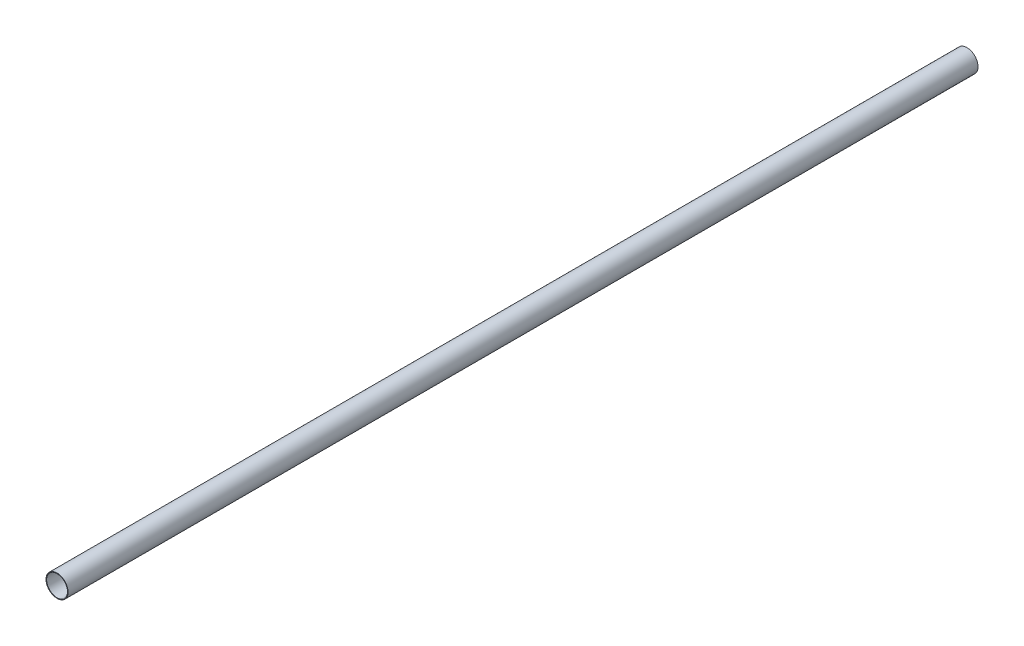
ISO-10303-21;
HEADER;
FILE_DESCRIPTION(('STEP AP214'),'2;1');
FILE_NAME('part.step','',(''),(''),'','','');
FILE_SCHEMA(('AUTOMOTIVE_DESIGN { 1 0 10303 214 1 1 1 1 }'));
ENDSEC;
DATA;
#1=APPLICATION_CONTEXT('core data for automotive mechanical design processes');
#2=APPLICATION_PROTOCOL_DEFINITION('international standard','automotive_design',2000,#1);
#3=PRODUCT_CONTEXT('',#1,'mechanical');
#4=PRODUCT('Part','Part','',(#3));
#5=PRODUCT_RELATED_PRODUCT_CATEGORY('part','',(#4));
#6=PRODUCT_DEFINITION_FORMATION('','',#4);
#7=PRODUCT_DEFINITION_CONTEXT('part definition',#1,'design');
#8=PRODUCT_DEFINITION('design','',#6,#7);
#9=PRODUCT_DEFINITION_SHAPE('','',#8);
#10=(LENGTH_UNIT() NAMED_UNIT(*) SI_UNIT(.MILLI.,.METRE.));
#11=(NAMED_UNIT(*) PLANE_ANGLE_UNIT() SI_UNIT($,.RADIAN.));
#12=(NAMED_UNIT(*) SI_UNIT($,.STERADIAN.) SOLID_ANGLE_UNIT());
#13=UNCERTAINTY_MEASURE_WITH_UNIT(LENGTH_MEASURE(1.E-05),#10,'distance_accuracy_value','');
#14=(GEOMETRIC_REPRESENTATION_CONTEXT(3) GLOBAL_UNCERTAINTY_ASSIGNED_CONTEXT((#13)) GLOBAL_UNIT_ASSIGNED_CONTEXT((#10,
#11,#12)) REPRESENTATION_CONTEXT('',''));
#15=CARTESIAN_POINT('',(0.,0.,0.));
#16=DIRECTION('',(0.,0.,1.));
#17=DIRECTION('',(1.,0.,0.));
#18=AXIS2_PLACEMENT_3D('',#15,#16,#17);
#19=CARTESIAN_POINT('',(0.,0.,927.5));
#20=DIRECTION('',(0.,0.,1.));
#21=DIRECTION('',(1.,0.,0.));
#22=AXIS2_PLACEMENT_3D('',#19,#20,#21);
#23=PLANE('',#22);
#24=CARTESIAN_POINT('',(0.,0.,927.5));
#25=DIRECTION('',(0.,0.,1.));
#26=DIRECTION('',(1.,0.,0.));
#27=AXIS2_PLACEMENT_3D('',#24,#25,#26);
#28=CIRCLE('',#27,11.25);
#29=CARTESIAN_POINT('',(-11.25,0.,927.5));
#30=VERTEX_POINT('',#29);
#31=EDGE_CURVE('E10',#30,#30,#28,.T.);
#32=ORIENTED_EDGE('',*,*,#31,.T.);
#33=EDGE_LOOP('',(#32));
#34=FACE_BOUND('',#33,.T.);
#35=CARTESIAN_POINT('',(0.,0.,927.5));
#36=DIRECTION('',(0.,0.,1.));
#37=DIRECTION('',(1.,0.,0.));
#38=AXIS2_PLACEMENT_3D('',#35,#36,#37);
#39=CIRCLE('',#38,10.65);
#40=CARTESIAN_POINT('',(-10.65,0.,927.5));
#41=VERTEX_POINT('',#40);
#42=EDGE_CURVE('E44',#41,#41,#39,.T.);
#43=ORIENTED_EDGE('',*,*,#42,.F.);
#44=EDGE_LOOP('',(#43));
#45=FACE_BOUND('',#44,.T.);
#46=ADVANCED_FACE('F33',(#34,#45),#23,.T.);
#47=CARTESIAN_POINT('',(0.,0.,0.));
#48=DIRECTION('',(0.,0.,1.));
#49=DIRECTION('',(1.,0.,0.));
#50=AXIS2_PLACEMENT_3D('',#47,#48,#49);
#51=PLANE('',#50);
#52=CARTESIAN_POINT('',(0.,0.,0.));
#53=DIRECTION('',(0.,0.,1.));
#54=DIRECTION('',(1.,0.,0.));
#55=AXIS2_PLACEMENT_3D('',#52,#53,#54);
#56=CIRCLE('',#55,11.25);
#57=CARTESIAN_POINT('',(-11.25,0.,-1.11022302462516E-13));
#58=VERTEX_POINT('',#57);
#59=EDGE_CURVE('E37',#58,#58,#56,.T.);
#60=ORIENTED_EDGE('',*,*,#59,.F.);
#61=EDGE_LOOP('',(#60));
#62=FACE_BOUND('',#61,.T.);
#63=CARTESIAN_POINT('',(0.,0.,0.));
#64=DIRECTION('',(0.,0.,1.));
#65=DIRECTION('',(1.,0.,0.));
#66=AXIS2_PLACEMENT_3D('',#63,#64,#65);
#67=CIRCLE('',#66,10.65);
#68=CARTESIAN_POINT('',(-10.65,0.,-1.11022302462516E-13));
#69=VERTEX_POINT('',#68);
#70=EDGE_CURVE('E46',#69,#69,#67,.T.);
#71=ORIENTED_EDGE('',*,*,#70,.T.);
#72=EDGE_LOOP('',(#71));
#73=FACE_BOUND('',#72,.T.);
#74=ADVANCED_FACE('F56',(#62,#73),#51,.F.);
#75=CARTESIAN_POINT('',(0.,0.,927.5));
#76=DIRECTION('',(0.,0.,-1.));
#77=DIRECTION('',(-1.,0.,0.));
#78=AXIS2_PLACEMENT_3D('',#75,#76,#77);
#79=CYLINDRICAL_SURFACE('',#78,11.25);
#80=CARTESIAN_POINT('',(-11.25,0.,927.5));
#81=CARTESIAN_POINT('',(-11.25,0.,917.838541666667));
#82=CARTESIAN_POINT('',(-11.25,0.,908.177083333333));
#83=CARTESIAN_POINT('',(-11.25,0.,888.854166666667));
#84=CARTESIAN_POINT('',(-11.25,0.,879.192708333333));
#85=CARTESIAN_POINT('',(-11.25,0.,859.869791666667));
#86=CARTESIAN_POINT('',(-11.25,0.,850.208333333333));
#87=CARTESIAN_POINT('',(-11.25,0.,830.885416666667));
#88=CARTESIAN_POINT('',(-11.25,0.,821.223958333333));
#89=CARTESIAN_POINT('',(-11.25,0.,801.901041666667));
#90=CARTESIAN_POINT('',(-11.25,0.,792.239583333333));
#91=CARTESIAN_POINT('',(-11.25,0.,772.916666666667));
#92=CARTESIAN_POINT('',(-11.25,0.,763.255208333333));
#93=CARTESIAN_POINT('',(-11.25,0.,743.932291666667));
#94=CARTESIAN_POINT('',(-11.25,0.,734.270833333333));
#95=CARTESIAN_POINT('',(-11.25,0.,714.947916666667));
#96=CARTESIAN_POINT('',(-11.25,0.,705.286458333333));
#97=CARTESIAN_POINT('',(-11.25,0.,685.963541666667));
#98=CARTESIAN_POINT('',(-11.25,0.,676.302083333333));
#99=CARTESIAN_POINT('',(-11.25,0.,656.979166666667));
#100=CARTESIAN_POINT('',(-11.25,0.,647.317708333333));
#101=CARTESIAN_POINT('',(-11.25,0.,627.994791666667));
#102=CARTESIAN_POINT('',(-11.25,0.,618.333333333333));
#103=CARTESIAN_POINT('',(-11.25,0.,599.010416666667));
#104=CARTESIAN_POINT('',(-11.25,0.,589.348958333333));
#105=CARTESIAN_POINT('',(-11.25,0.,570.026041666667));
#106=CARTESIAN_POINT('',(-11.25,0.,560.364583333333));
#107=CARTESIAN_POINT('',(-11.25,0.,541.041666666667));
#108=CARTESIAN_POINT('',(-11.25,0.,531.380208333333));
#109=CARTESIAN_POINT('',(-11.25,0.,512.057291666667));
#110=CARTESIAN_POINT('',(-11.25,0.,502.395833333333));
#111=CARTESIAN_POINT('',(-11.25,0.,483.072916666667));
#112=CARTESIAN_POINT('',(-11.25,0.,473.411458333333));
#113=CARTESIAN_POINT('',(-11.25,0.,454.088541666667));
#114=CARTESIAN_POINT('',(-11.25,0.,444.427083333333));
#115=CARTESIAN_POINT('',(-11.25,0.,425.104166666667));
#116=CARTESIAN_POINT('',(-11.25,0.,415.442708333333));
#117=CARTESIAN_POINT('',(-11.25,0.,396.119791666667));
#118=CARTESIAN_POINT('',(-11.25,0.,386.458333333333));
#119=CARTESIAN_POINT('',(-11.25,0.,367.135416666667));
#120=CARTESIAN_POINT('',(-11.25,0.,357.473958333333));
#121=CARTESIAN_POINT('',(-11.25,0.,338.151041666667));
#122=CARTESIAN_POINT('',(-11.25,0.,328.489583333333));
#123=CARTESIAN_POINT('',(-11.25,0.,309.166666666667));
#124=CARTESIAN_POINT('',(-11.25,0.,299.505208333333));
#125=CARTESIAN_POINT('',(-11.25,0.,280.182291666667));
#126=CARTESIAN_POINT('',(-11.25,0.,270.520833333333));
#127=CARTESIAN_POINT('',(-11.25,0.,251.197916666667));
#128=CARTESIAN_POINT('',(-11.25,0.,241.536458333333));
#129=CARTESIAN_POINT('',(-11.25,0.,222.213541666667));
#130=CARTESIAN_POINT('',(-11.25,0.,212.552083333333));
#131=CARTESIAN_POINT('',(-11.25,0.,193.229166666667));
#132=CARTESIAN_POINT('',(-11.25,0.,183.567708333333));
#133=CARTESIAN_POINT('',(-11.25,0.,164.244791666667));
#134=CARTESIAN_POINT('',(-11.25,0.,154.583333333333));
#135=CARTESIAN_POINT('',(-11.25,0.,135.260416666667));
#136=CARTESIAN_POINT('',(-11.25,0.,125.598958333333));
#137=CARTESIAN_POINT('',(-11.25,0.,106.276041666667));
#138=CARTESIAN_POINT('',(-11.25,0.,96.6145833333332));
#139=CARTESIAN_POINT('',(-11.25,0.,77.2916666666665));
#140=CARTESIAN_POINT('',(-11.25,0.,67.6302083333332));
#141=CARTESIAN_POINT('',(-11.25,0.,48.3072916666666));
#142=CARTESIAN_POINT('',(-11.25,0.,38.6458333333333));
#143=CARTESIAN_POINT('',(-11.25,0.,19.3229166666666));
#144=CARTESIAN_POINT('',(-11.25,0.,9.66145833333324));
#145=CARTESIAN_POINT('',(-11.25,0.,-1.11022302462516E-13));
#146=B_SPLINE_CURVE_WITH_KNOTS('',3,(#80,#81,#82,#83,#84,#85,#86,#87,#88,#89,#90,#91,#92,#93,
#94,#95,#96,#97,#98,#99,#100,#101,#102,#103,#104,#105,#106,#107,#108,#109,#110,#111,#112,#113,
#114,#115,#116,#117,#118,#119,#120,#121,#122,#123,#124,#125,#126,#127,#128,#129,#130,#131,#132,
#133,#134,#135,#136,#137,#138,#139,#140,#141,#142,#143,#144,#145),.UNSPECIFIED.,.F.,.F.,(4,2,2,
2,2,2,2,2,2,2,2,2,2,2,2,2,2,2,2,2,2,2,2,2,2,2,2,2,2,2,2,2,4),(0.,28.9843750000001,57.96875,
86.9531250000001,115.9375,144.921875,173.90625,202.890625,231.875,260.859375,289.84375,
318.828125,347.8125,376.796875,405.78125,434.765625,463.75,492.734375,521.71875,550.703125,
579.6875,608.671875,637.65625,666.640625,695.625,724.609375,753.59375,782.578125,811.5625,
840.546875,869.53125,898.515625,927.5),.UNSPECIFIED.);
#147=EDGE_CURVE('BSEAM35',#30,#58,#146,.T.);
#148=ORIENTED_EDGE('',*,*,#31,.F.);
#149=ORIENTED_EDGE('',*,*,#59,.T.);
#150=ORIENTED_EDGE('',*,*,#147,.T.);
#151=ORIENTED_EDGE('',*,*,#147,.F.);
#152=EDGE_LOOP('',(#148,#150,#149,#151));
#153=FACE_BOUND('',#152,.T.);
#154=ADVANCED_FACE('F35',(#153),#79,.T.);
#155=CARTESIAN_POINT('',(0.,0.,927.5));
#156=DIRECTION('',(0.,0.,-1.));
#157=DIRECTION('',(-1.,0.,0.));
#158=AXIS2_PLACEMENT_3D('',#155,#156,#157);
#159=CYLINDRICAL_SURFACE('',#158,10.65);
#160=CARTESIAN_POINT('',(-10.65,0.,927.5));
#161=CARTESIAN_POINT('',(-10.65,0.,917.838541666667));
#162=CARTESIAN_POINT('',(-10.65,0.,908.177083333333));
#163=CARTESIAN_POINT('',(-10.65,0.,888.854166666667));
#164=CARTESIAN_POINT('',(-10.65,0.,879.192708333333));
#165=CARTESIAN_POINT('',(-10.65,0.,859.869791666667));
#166=CARTESIAN_POINT('',(-10.65,0.,850.208333333333));
#167=CARTESIAN_POINT('',(-10.65,0.,830.885416666667));
#168=CARTESIAN_POINT('',(-10.65,0.,821.223958333333));
#169=CARTESIAN_POINT('',(-10.65,0.,801.901041666667));
#170=CARTESIAN_POINT('',(-10.65,0.,792.239583333333));
#171=CARTESIAN_POINT('',(-10.65,0.,772.916666666667));
#172=CARTESIAN_POINT('',(-10.65,0.,763.255208333333));
#173=CARTESIAN_POINT('',(-10.65,0.,743.932291666667));
#174=CARTESIAN_POINT('',(-10.65,0.,734.270833333333));
#175=CARTESIAN_POINT('',(-10.65,0.,714.947916666667));
#176=CARTESIAN_POINT('',(-10.65,0.,705.286458333333));
#177=CARTESIAN_POINT('',(-10.65,0.,685.963541666667));
#178=CARTESIAN_POINT('',(-10.65,0.,676.302083333333));
#179=CARTESIAN_POINT('',(-10.65,0.,656.979166666667));
#180=CARTESIAN_POINT('',(-10.65,0.,647.317708333333));
#181=CARTESIAN_POINT('',(-10.65,0.,627.994791666667));
#182=CARTESIAN_POINT('',(-10.65,0.,618.333333333333));
#183=CARTESIAN_POINT('',(-10.65,0.,599.010416666667));
#184=CARTESIAN_POINT('',(-10.65,0.,589.348958333333));
#185=CARTESIAN_POINT('',(-10.65,0.,570.026041666667));
#186=CARTESIAN_POINT('',(-10.65,0.,560.364583333333));
#187=CARTESIAN_POINT('',(-10.65,0.,541.041666666667));
#188=CARTESIAN_POINT('',(-10.65,0.,531.380208333333));
#189=CARTESIAN_POINT('',(-10.65,0.,512.057291666667));
#190=CARTESIAN_POINT('',(-10.65,0.,502.395833333333));
#191=CARTESIAN_POINT('',(-10.65,0.,483.072916666667));
#192=CARTESIAN_POINT('',(-10.65,0.,473.411458333333));
#193=CARTESIAN_POINT('',(-10.65,0.,454.088541666667));
#194=CARTESIAN_POINT('',(-10.65,0.,444.427083333333));
#195=CARTESIAN_POINT('',(-10.65,0.,425.104166666667));
#196=CARTESIAN_POINT('',(-10.65,0.,415.442708333333));
#197=CARTESIAN_POINT('',(-10.65,0.,396.119791666667));
#198=CARTESIAN_POINT('',(-10.65,0.,386.458333333333));
#199=CARTESIAN_POINT('',(-10.65,0.,367.135416666667));
#200=CARTESIAN_POINT('',(-10.65,0.,357.473958333333));
#201=CARTESIAN_POINT('',(-10.65,0.,338.151041666667));
#202=CARTESIAN_POINT('',(-10.65,0.,328.489583333333));
#203=CARTESIAN_POINT('',(-10.65,0.,309.166666666667));
#204=CARTESIAN_POINT('',(-10.65,0.,299.505208333333));
#205=CARTESIAN_POINT('',(-10.65,0.,280.182291666667));
#206=CARTESIAN_POINT('',(-10.65,0.,270.520833333333));
#207=CARTESIAN_POINT('',(-10.65,0.,251.197916666667));
#208=CARTESIAN_POINT('',(-10.65,0.,241.536458333333));
#209=CARTESIAN_POINT('',(-10.65,0.,222.213541666667));
#210=CARTESIAN_POINT('',(-10.65,0.,212.552083333333));
#211=CARTESIAN_POINT('',(-10.65,0.,193.229166666667));
#212=CARTESIAN_POINT('',(-10.65,0.,183.567708333333));
#213=CARTESIAN_POINT('',(-10.65,0.,164.244791666667));
#214=CARTESIAN_POINT('',(-10.65,0.,154.583333333333));
#215=CARTESIAN_POINT('',(-10.65,0.,135.260416666667));
#216=CARTESIAN_POINT('',(-10.65,0.,125.598958333333));
#217=CARTESIAN_POINT('',(-10.65,0.,106.276041666667));
#218=CARTESIAN_POINT('',(-10.65,0.,96.6145833333332));
#219=CARTESIAN_POINT('',(-10.65,0.,77.2916666666665));
#220=CARTESIAN_POINT('',(-10.65,0.,67.6302083333332));
#221=CARTESIAN_POINT('',(-10.65,0.,48.3072916666666));
#222=CARTESIAN_POINT('',(-10.65,0.,38.6458333333332));
#223=CARTESIAN_POINT('',(-10.65,0.,19.3229166666665));
#224=CARTESIAN_POINT('',(-10.65,0.,9.66145833333321));
#225=CARTESIAN_POINT('',(-10.65,0.,-1.11022302462516E-13));
#226=B_SPLINE_CURVE_WITH_KNOTS('',3,(#160,#161,#162,#163,#164,#165,#166,#167,#168,#169,#170,
#171,#172,#173,#174,#175,#176,#177,#178,#179,#180,#181,#182,#183,#184,#185,#186,#187,#188,#189,
#190,#191,#192,#193,#194,#195,#196,#197,#198,#199,#200,#201,#202,#203,#204,#205,#206,#207,#208,
#209,#210,#211,#212,#213,#214,#215,#216,#217,#218,#219,#220,#221,#222,#223,#224,#225),
.UNSPECIFIED.,.F.,.F.,(4,2,2,2,2,2,2,2,2,2,2,2,2,2,2,2,2,2,2,2,2,2,2,2,2,2,2,2,2,2,2,2,4),(0.,
28.984375,57.9687499999999,86.953125,115.9375,144.921875,173.90625,202.890625,231.875,
260.859375,289.84375,318.828125,347.8125,376.796875,405.78125,434.765625,463.75,492.734375,
521.71875,550.703125,579.6875,608.671875,637.65625,666.640625,695.625,724.609375,753.59375,
782.578125,811.5625,840.546875,869.53125,898.515625,927.5),.UNSPECIFIED.);
#227=EDGE_CURVE('BSEAM52',#41,#69,#226,.T.);
#228=ORIENTED_EDGE('',*,*,#42,.T.);
#229=ORIENTED_EDGE('',*,*,#70,.F.);
#230=ORIENTED_EDGE('',*,*,#227,.T.);
#231=ORIENTED_EDGE('',*,*,#227,.F.);
#232=EDGE_LOOP('',(#228,#230,#229,#231));
#233=FACE_BOUND('',#232,.T.);
#234=ADVANCED_FACE('F52',(#233),#159,.F.);
#235=CLOSED_SHELL('',(#46,#74,#154,#234));
#236=MANIFOLD_SOLID_BREP('B2',#235);
#237=ADVANCED_BREP_SHAPE_REPRESENTATION('',(#18,#236),#14);
#238=SHAPE_DEFINITION_REPRESENTATION(#9,#237);
ENDSEC;
END-ISO-10303-21;
